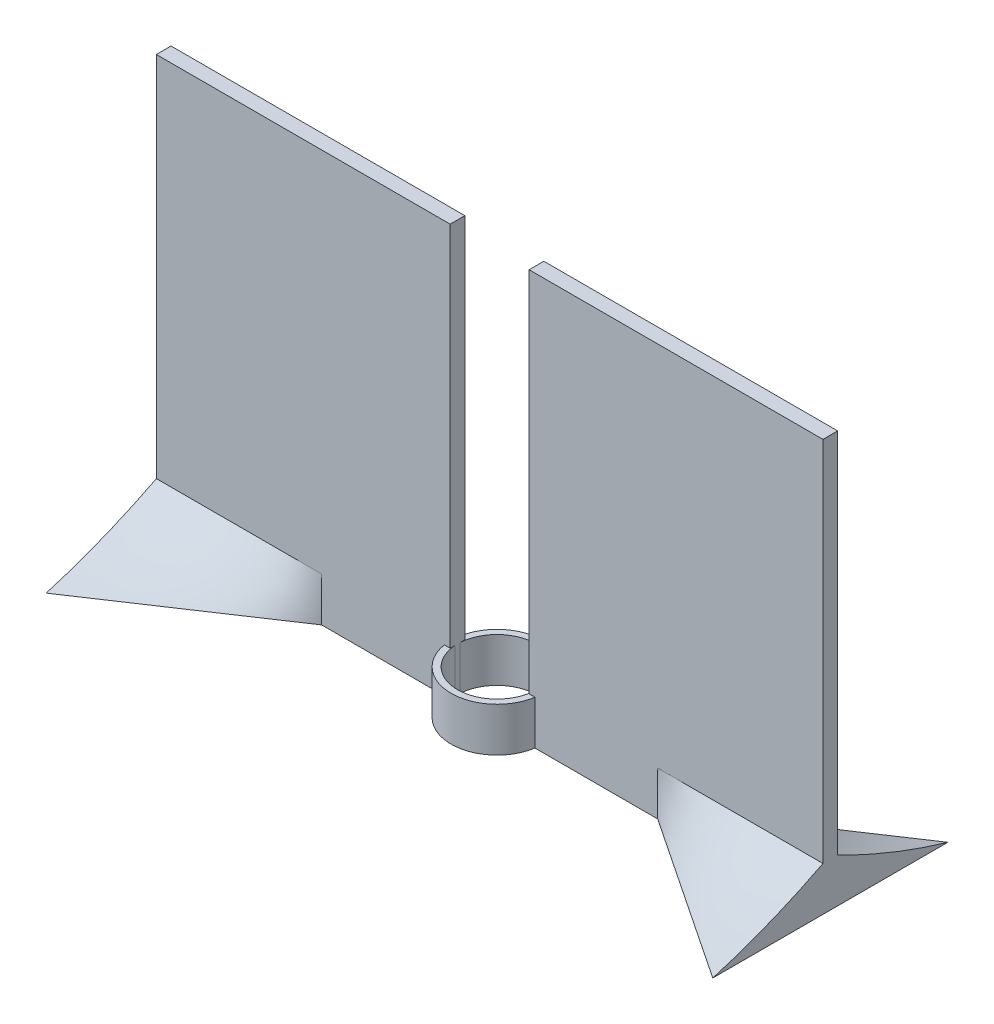
ISO-10303-21;
HEADER;
FILE_DESCRIPTION(('STEP AP214'),'2;1');
FILE_NAME('part.step','',(''),(''),'','','');
FILE_SCHEMA(('AUTOMOTIVE_DESIGN { 1 0 10303 214 1 1 1 1 }'));
ENDSEC;
DATA;
#1=APPLICATION_CONTEXT('core data for automotive mechanical design processes');
#2=APPLICATION_PROTOCOL_DEFINITION('international standard','automotive_design',2000,#1);
#3=PRODUCT_CONTEXT('',#1,'mechanical');
#4=PRODUCT('Part','Part','',(#3));
#5=PRODUCT_RELATED_PRODUCT_CATEGORY('part','',(#4));
#6=PRODUCT_DEFINITION_FORMATION('','',#4);
#7=PRODUCT_DEFINITION_CONTEXT('part definition',#1,'design');
#8=PRODUCT_DEFINITION('design','',#6,#7);
#9=PRODUCT_DEFINITION_SHAPE('','',#8);
#10=(LENGTH_UNIT() NAMED_UNIT(*) SI_UNIT(.MILLI.,.METRE.));
#11=(NAMED_UNIT(*) PLANE_ANGLE_UNIT() SI_UNIT($,.RADIAN.));
#12=(NAMED_UNIT(*) SI_UNIT($,.STERADIAN.) SOLID_ANGLE_UNIT());
#13=UNCERTAINTY_MEASURE_WITH_UNIT(LENGTH_MEASURE(1.E-05),#10,'distance_accuracy_value','');
#14=(GEOMETRIC_REPRESENTATION_CONTEXT(3) GLOBAL_UNCERTAINTY_ASSIGNED_CONTEXT((#13)) GLOBAL_UNIT_ASSIGNED_CONTEXT((#10,
#11,#12)) REPRESENTATION_CONTEXT('',''));
#15=CARTESIAN_POINT('',(0.,0.,0.));
#16=DIRECTION('',(0.,0.,1.));
#17=DIRECTION('',(1.,0.,0.));
#18=AXIS2_PLACEMENT_3D('',#15,#16,#17);
#19=CARTESIAN_POINT('',(0.,12.,0.));
#20=DIRECTION('',(0.,-1.,0.));
#21=DIRECTION('',(0.,0.,-1.));
#22=AXIS2_PLACEMENT_3D('',#19,#20,#21);
#23=CYLINDRICAL_SURFACE('',#22,10.775);
#24=CARTESIAN_POINT('',(0.,12.,0.));
#25=DIRECTION('',(0.,1.,0.));
#26=DIRECTION('',(0.,0.,1.));
#27=AXIS2_PLACEMENT_3D('',#24,#25,#26);
#28=CIRCLE('',#27,10.775);
#29=CARTESIAN_POINT('',(10.75,12.,-0.733570037556071));
#30=VERTEX_POINT('',#29);
#31=CARTESIAN_POINT('',(-10.75,12.,-0.733570037556071));
#32=VERTEX_POINT('',#31);
#33=EDGE_CURVE('E522',#30,#32,#28,.T.);
#34=ORIENTED_EDGE('',*,*,#33,.T.);
#35=DIRECTION('',(0.,-1.,0.));
#36=VECTOR('',#35,1.);
#37=CARTESIAN_POINT('',(-10.75,12.,-0.733570037556071));
#38=LINE('',#37,#36);
#39=CARTESIAN_POINT('',(-10.75,0.,-0.733570037556071));
#40=VERTEX_POINT('',#39);
#41=EDGE_CURVE('E81',#32,#40,#38,.T.);
#42=ORIENTED_EDGE('',*,*,#41,.T.);
#43=CARTESIAN_POINT('',(0.,0.,0.));
#44=DIRECTION('',(0.,1.,0.));
#45=DIRECTION('',(0.,0.,1.));
#46=AXIS2_PLACEMENT_3D('',#43,#44,#45);
#47=CIRCLE('',#46,10.775);
#48=CARTESIAN_POINT('',(10.75,0.,-0.733570037556071));
#49=VERTEX_POINT('',#48);
#50=EDGE_CURVE('E491',#49,#40,#47,.T.);
#51=ORIENTED_EDGE('',*,*,#50,.F.);
#52=DIRECTION('',(0.,-1.,0.));
#53=VECTOR('',#52,1.);
#54=CARTESIAN_POINT('',(10.75,12.,-0.733570037556071));
#55=LINE('',#54,#53);
#56=EDGE_CURVE('E488',#30,#49,#55,.T.);
#57=ORIENTED_EDGE('',*,*,#56,.F.);
#58=EDGE_LOOP('',(#34,#42,#51,#57));
#59=FACE_BOUND('',#58,.T.);
#60=ADVANCED_FACE('F53',(#59),#23,.F.);
#61=CARTESIAN_POINT('',(-10.75,0.,0.733570037556071));
#62=VERTEX_POINT('',#61);
#63=CARTESIAN_POINT('',(10.75,0.,0.733570037556071));
#64=VERTEX_POINT('',#63);
#65=EDGE_CURVE('E73',#62,#64,#47,.T.);
#66=ORIENTED_EDGE('',*,*,#65,.F.);
#67=DIRECTION('',(0.,-1.,0.));
#68=VECTOR('',#67,1.);
#69=CARTESIAN_POINT('',(-10.75,12.,0.733570037556071));
#70=LINE('',#69,#68);
#71=CARTESIAN_POINT('',(-10.75,12.,0.733570037556071));
#72=VERTEX_POINT('',#71);
#73=EDGE_CURVE('E526',#62,#72,#70,.F.);
#74=ORIENTED_EDGE('',*,*,#73,.T.);
#75=CARTESIAN_POINT('',(10.75,12.,0.733570037556071));
#76=VERTEX_POINT('',#75);
#77=EDGE_CURVE('E495',#72,#76,#28,.T.);
#78=ORIENTED_EDGE('',*,*,#77,.T.);
#79=DIRECTION('',(0.,-1.,0.));
#80=VECTOR('',#79,1.);
#81=CARTESIAN_POINT('',(10.75,12.,0.733570037556071));
#82=LINE('',#81,#80);
#83=EDGE_CURVE('E486',#64,#76,#82,.F.);
#84=ORIENTED_EDGE('',*,*,#83,.F.);
#85=EDGE_LOOP('',(#66,#74,#78,#84));
#86=FACE_BOUND('',#85,.T.);
#87=ADVANCED_FACE('F261',(#86),#23,.F.);
#88=CARTESIAN_POINT('',(0.,12.,0.));
#89=DIRECTION('',(0.,1.,0.));
#90=DIRECTION('',(0.,0.,1.));
#91=AXIS2_PLACEMENT_3D('',#88,#89,#90);
#92=PLANE('',#91);
#93=DIRECTION('',(0.,0.,1.));
#94=VECTOR('',#93,1.);
#95=CARTESIAN_POINT('',(-10.75,12.,0.));
#96=LINE('',#95,#94);
#97=CARTESIAN_POINT('',(-10.75,12.,2.));
#98=VERTEX_POINT('',#97);
#99=EDGE_CURVE('E65',#72,#98,#96,.T.);
#100=ORIENTED_EDGE('',*,*,#99,.T.);
#101=DIRECTION('',(-1.,0.,0.));
#102=VECTOR('',#101,1.);
#103=CARTESIAN_POINT('',(0.,12.,2.));
#104=LINE('',#103,#102);
#105=CARTESIAN_POINT('',(-12.3389626792531,12.,2.));
#106=VERTEX_POINT('',#105);
#107=EDGE_CURVE('E530',#98,#106,#104,.T.);
#108=ORIENTED_EDGE('',*,*,#107,.T.);
#109=CARTESIAN_POINT('',(0.,12.,0.));
#110=DIRECTION('',(0.,1.,0.));
#111=DIRECTION('',(0.,0.,1.));
#112=AXIS2_PLACEMENT_3D('',#109,#110,#111);
#113=CIRCLE('',#112,12.5);
#114=CARTESIAN_POINT('',(12.3389626792531,12.,2.));
#115=VERTEX_POINT('',#114);
#116=EDGE_CURVE('E517',#106,#115,#113,.T.);
#117=ORIENTED_EDGE('',*,*,#116,.T.);
#118=DIRECTION('',(1.,0.,0.));
#119=VECTOR('',#118,1.);
#120=CARTESIAN_POINT('',(90.75,12.,2.));
#121=LINE('',#120,#119);
#122=CARTESIAN_POINT('',(10.75,12.,2.));
#123=VERTEX_POINT('',#122);
#124=EDGE_CURVE('E507',#123,#115,#121,.T.);
#125=ORIENTED_EDGE('',*,*,#124,.F.);
#126=DIRECTION('',(0.,0.,1.));
#127=VECTOR('',#126,1.);
#128=CARTESIAN_POINT('',(10.75,12.,0.));
#129=LINE('',#128,#127);
#130=EDGE_CURVE('E382',#76,#123,#129,.T.);
#131=ORIENTED_EDGE('',*,*,#130,.F.);
#132=ORIENTED_EDGE('',*,*,#77,.F.);
#133=EDGE_LOOP('',(#100,#108,#117,#125,#131,#132));
#134=FACE_BOUND('',#133,.T.);
#135=ADVANCED_FACE('F268',(#134),#92,.T.);
#136=CARTESIAN_POINT('',(0.,12.,0.));
#137=DIRECTION('',(0.,-1.,0.));
#138=DIRECTION('',(0.,0.,-1.));
#139=AXIS2_PLACEMENT_3D('',#136,#137,#138);
#140=CYLINDRICAL_SURFACE('',#139,12.5);
#141=DIRECTION('',(0.,-1.,0.));
#142=VECTOR('',#141,1.);
#143=CARTESIAN_POINT('',(-12.3389626792531,12.,2.));
#144=LINE('',#143,#142);
#145=CARTESIAN_POINT('',(-12.3389626792531,0.,2.));
#146=VERTEX_POINT('',#145);
#147=EDGE_CURVE('E661',#146,#106,#144,.F.);
#148=ORIENTED_EDGE('',*,*,#147,.F.);
#149=CARTESIAN_POINT('',(0.,0.,0.));
#150=DIRECTION('',(0.,1.,0.));
#151=DIRECTION('',(0.,0.,1.));
#152=AXIS2_PLACEMENT_3D('',#149,#150,#151);
#153=CIRCLE('',#152,12.5);
#154=CARTESIAN_POINT('',(12.3389626792531,0.,2.));
#155=VERTEX_POINT('',#154);
#156=EDGE_CURVE('E225',#146,#155,#153,.T.);
#157=ORIENTED_EDGE('',*,*,#156,.T.);
#158=DIRECTION('',(0.,-1.,0.));
#159=VECTOR('',#158,1.);
#160=CARTESIAN_POINT('',(12.3389626792531,12.,2.));
#161=LINE('',#160,#159);
#162=EDGE_CURVE('E496',#155,#115,#161,.F.);
#163=ORIENTED_EDGE('',*,*,#162,.T.);
#164=ORIENTED_EDGE('',*,*,#116,.F.);
#165=EDGE_LOOP('',(#148,#157,#163,#164));
#166=FACE_BOUND('',#165,.T.);
#167=ADVANCED_FACE('F273',(#166),#140,.T.);
#168=CARTESIAN_POINT('',(90.75,112.,-2.));
#169=DIRECTION('',(0.,0.,-1.));
#170=DIRECTION('',(-1.,0.,0.));
#171=AXIS2_PLACEMENT_3D('',#168,#169,#170);
#172=PLANE('',#171);
#173=DIRECTION('',(1.,0.,0.));
#174=VECTOR('',#173,1.);
#175=CARTESIAN_POINT('',(90.75,12.,-2.));
#176=LINE('',#175,#174);
#177=CARTESIAN_POINT('',(10.75,12.,-2.));
#178=VERTEX_POINT('',#177);
#179=CARTESIAN_POINT('',(12.3389626792531,12.,-2.));
#180=VERTEX_POINT('',#179);
#181=EDGE_CURVE('E473',#178,#180,#176,.T.);
#182=ORIENTED_EDGE('',*,*,#181,.F.);
#183=DIRECTION('',(0.,-1.,0.));
#184=VECTOR('',#183,1.);
#185=CARTESIAN_POINT('',(10.75,112.,-2.));
#186=LINE('',#185,#184);
#187=CARTESIAN_POINT('',(10.75,112.,-2.));
#188=VERTEX_POINT('',#187);
#189=EDGE_CURVE('E370',#188,#178,#186,.T.);
#190=ORIENTED_EDGE('',*,*,#189,.F.);
#191=DIRECTION('',(-1.,0.,0.));
#192=VECTOR('',#191,1.);
#193=CARTESIAN_POINT('',(90.75,112.,-2.));
#194=LINE('',#193,#192);
#195=CARTESIAN_POINT('',(90.75,112.,-2.));
#196=VERTEX_POINT('',#195);
#197=EDGE_CURVE('E365',#196,#188,#194,.T.);
#198=ORIENTED_EDGE('',*,*,#197,.F.);
#199=DIRECTION('',(0.,-1.,0.));
#200=VECTOR('',#199,1.);
#201=CARTESIAN_POINT('',(90.75,112.,-2.));
#202=LINE('',#201,#200);
#203=CARTESIAN_POINT('',(90.75,12.,-2.));
#204=VERTEX_POINT('',#203);
#205=EDGE_CURVE('E408',#196,#204,#202,.T.);
#206=ORIENTED_EDGE('',*,*,#205,.T.);
#207=DIRECTION('',(-1.,0.,0.));
#208=VECTOR('',#207,1.);
#209=CARTESIAN_POINT('',(90.75,12.,-2.));
#210=LINE('',#209,#208);
#211=CARTESIAN_POINT('',(45.75,12.,-2.));
#212=VERTEX_POINT('',#211);
#213=EDGE_CURVE('E391',#204,#212,#210,.T.);
#214=ORIENTED_EDGE('',*,*,#213,.T.);
#215=CARTESIAN_POINT('',(45.75,0.,-2.));
#216=CARTESIAN_POINT('',(45.75,2.00000000000001,-2.));
#217=CARTESIAN_POINT('',(45.75,4.00000000000001,-2.));
#218=CARTESIAN_POINT('',(45.75,8.00000000000001,-2.));
#219=CARTESIAN_POINT('',(45.75,10.,-2.));
#220=CARTESIAN_POINT('',(45.75,12.,-2.));
#221=B_SPLINE_CURVE_WITH_KNOTS('',3,(#215,#216,#217,#218,#219,#220),.UNSPECIFIED.,.F.,.F.,(4,2,
4),(0.,0.5,1.),.UNSPECIFIED.);
#222=CARTESIAN_POINT('',(45.75,0.,-2.));
#223=VERTEX_POINT('',#222);
#224=EDGE_CURVE('E331',#212,#223,#221,.F.);
#225=ORIENTED_EDGE('',*,*,#224,.T.);
#226=DIRECTION('',(-1.,0.,0.));
#227=VECTOR('',#226,1.);
#228=CARTESIAN_POINT('',(45.75,0.,-2.));
#229=LINE('',#228,#227);
#230=CARTESIAN_POINT('',(12.3389626792531,0.,-2.));
#231=VERTEX_POINT('',#230);
#232=EDGE_CURVE('E337',#223,#231,#229,.T.);
#233=ORIENTED_EDGE('',*,*,#232,.T.);
#234=DIRECTION('',(0.,-1.,0.));
#235=VECTOR('',#234,1.);
#236=CARTESIAN_POINT('',(12.3389626792531,12.,-2.));
#237=LINE('',#236,#235);
#238=EDGE_CURVE('E499',#231,#180,#237,.F.);
#239=ORIENTED_EDGE('',*,*,#238,.T.);
#240=EDGE_LOOP('',(#182,#190,#198,#206,#214,#225,#233,#239));
#241=FACE_BOUND('',#240,.T.);
#242=ADVANCED_FACE('F339',(#241),#172,.T.);
#243=CARTESIAN_POINT('',(90.75,112.,-2.));
#244=DIRECTION('',(0.,-1.,0.));
#245=DIRECTION('',(0.,0.,-1.));
#246=AXIS2_PLACEMENT_3D('',#243,#244,#245);
#247=PLANE('',#246);
#248=DIRECTION('',(0.,0.,1.));
#249=VECTOR('',#248,1.);
#250=CARTESIAN_POINT('',(10.75,112.,-2.));
#251=LINE('',#250,#249);
#252=CARTESIAN_POINT('',(10.75,112.,2.));
#253=VERTEX_POINT('',#252);
#254=EDGE_CURVE('E360',#188,#253,#251,.T.);
#255=ORIENTED_EDGE('',*,*,#254,.T.);
#256=DIRECTION('',(-1.,0.,0.));
#257=VECTOR('',#256,1.);
#258=CARTESIAN_POINT('',(90.75,112.,2.));
#259=LINE('',#258,#257);
#260=CARTESIAN_POINT('',(90.75,112.,2.));
#261=VERTEX_POINT('',#260);
#262=EDGE_CURVE('E363',#261,#253,#259,.T.);
#263=ORIENTED_EDGE('',*,*,#262,.F.);
#264=DIRECTION('',(0.,0.,1.));
#265=VECTOR('',#264,1.);
#266=CARTESIAN_POINT('',(90.75,112.,-2.));
#267=LINE('',#266,#265);
#268=EDGE_CURVE('E387',#196,#261,#267,.T.);
#269=ORIENTED_EDGE('',*,*,#268,.F.);
#270=ORIENTED_EDGE('',*,*,#197,.T.);
#271=EDGE_LOOP('',(#255,#263,#269,#270));
#272=FACE_BOUND('',#271,.T.);
#273=ADVANCED_FACE('F348',(#272),#247,.F.);
#274=CARTESIAN_POINT('',(90.75,112.,2.));
#275=DIRECTION('',(0.,0.,-1.));
#276=DIRECTION('',(-1.,0.,0.));
#277=AXIS2_PLACEMENT_3D('',#274,#275,#276);
#278=PLANE('',#277);
#279=DIRECTION('',(0.,-1.,0.));
#280=VECTOR('',#279,1.);
#281=CARTESIAN_POINT('',(10.75,112.,2.));
#282=LINE('',#281,#280);
#283=EDGE_CURVE('E371',#253,#123,#282,.T.);
#284=ORIENTED_EDGE('',*,*,#283,.T.);
#285=ORIENTED_EDGE('',*,*,#124,.T.);
#286=ORIENTED_EDGE('',*,*,#162,.F.);
#287=DIRECTION('',(-1.,0.,0.));
#288=VECTOR('',#287,1.);
#289=CARTESIAN_POINT('',(45.75,0.,2.));
#290=LINE('',#289,#288);
#291=CARTESIAN_POINT('',(45.75,0.,2.));
#292=VERTEX_POINT('',#291);
#293=EDGE_CURVE('E383',#292,#155,#290,.T.);
#294=ORIENTED_EDGE('',*,*,#293,.F.);
#295=CARTESIAN_POINT('',(45.75,12.,2.));
#296=CARTESIAN_POINT('',(45.75,10.,2.));
#297=CARTESIAN_POINT('',(45.75,8.,2.));
#298=CARTESIAN_POINT('',(45.75,4.,2.));
#299=CARTESIAN_POINT('',(45.75,2.,2.));
#300=CARTESIAN_POINT('',(45.75,0.,2.));
#301=B_SPLINE_CURVE_WITH_KNOTS('',3,(#295,#296,#297,#298,#299,#300),.UNSPECIFIED.,.F.,.F.,(4,2,
4),(0.,0.5,1.),.UNSPECIFIED.);
#302=CARTESIAN_POINT('',(45.75,12.,2.));
#303=VERTEX_POINT('',#302);
#304=EDGE_CURVE('E397',#303,#292,#301,.T.);
#305=ORIENTED_EDGE('',*,*,#304,.F.);
#306=DIRECTION('',(-1.,0.,0.));
#307=VECTOR('',#306,1.);
#308=CARTESIAN_POINT('',(90.75,12.,2.));
#309=LINE('',#308,#307);
#310=CARTESIAN_POINT('',(90.75,12.,2.));
#311=VERTEX_POINT('',#310);
#312=EDGE_CURVE('E377',#311,#303,#309,.T.);
#313=ORIENTED_EDGE('',*,*,#312,.F.);
#314=DIRECTION('',(0.,-1.,0.));
#315=VECTOR('',#314,1.);
#316=CARTESIAN_POINT('',(90.75,112.,2.));
#317=LINE('',#316,#315);
#318=EDGE_CURVE('E376',#261,#311,#317,.T.);
#319=ORIENTED_EDGE('',*,*,#318,.F.);
#320=ORIENTED_EDGE('',*,*,#262,.T.);
#321=EDGE_LOOP('',(#284,#285,#286,#294,#305,#313,#319,#320));
#322=FACE_BOUND('',#321,.T.);
#323=ADVANCED_FACE('F55',(#322),#278,.F.);
#324=CARTESIAN_POINT('',(90.75,0.,0.));
#325=DIRECTION('',(1.,0.,0.));
#326=DIRECTION('',(0.,0.,-1.));
#327=AXIS2_PLACEMENT_3D('',#324,#325,#326);
#328=PLANE('',#327);
#329=ORIENTED_EDGE('',*,*,#318,.T.);
#330=CARTESIAN_POINT('',(90.75,12.,2.));
#331=CARTESIAN_POINT('',(90.75,4.56135462593959,16.4383660270901));
#332=CARTESIAN_POINT('',(90.75,0.,32.));
#333=B_SPLINE_CURVE_WITH_KNOTS('',2,(#330,#331,#332),.UNSPECIFIED.,.F.,.F.,(3,3),(0.,1.),.UNSPECIFIED.);
#334=CARTESIAN_POINT('',(90.75,0.,32.));
#335=VERTEX_POINT('',#334);
#336=EDGE_CURVE('E414',#311,#335,#333,.T.);
#337=ORIENTED_EDGE('',*,*,#336,.T.);
#338=DIRECTION('',(0.,0.,-1.));
#339=VECTOR('',#338,1.);
#340=CARTESIAN_POINT('',(90.75,0.,32.));
#341=LINE('',#340,#339);
#342=CARTESIAN_POINT('',(90.75,0.,-32.));
#343=VERTEX_POINT('',#342);
#344=EDGE_CURVE('E323',#335,#343,#341,.T.);
#345=ORIENTED_EDGE('',*,*,#344,.T.);
#346=CARTESIAN_POINT('',(90.75,0.,-32.));
#347=CARTESIAN_POINT('',(90.75,4.56135462593959,-16.4383660270901));
#348=CARTESIAN_POINT('',(90.75,12.,-2.));
#349=B_SPLINE_CURVE_WITH_KNOTS('',2,(#346,#347,#348),.UNSPECIFIED.,.F.,.F.,(3,3),(0.,1.),.UNSPECIFIED.);
#350=EDGE_CURVE('E318',#343,#204,#349,.T.);
#351=ORIENTED_EDGE('',*,*,#350,.T.);
#352=ORIENTED_EDGE('',*,*,#205,.F.);
#353=ORIENTED_EDGE('',*,*,#268,.T.);
#354=EDGE_LOOP('',(#329,#337,#345,#351,#352,#353));
#355=FACE_BOUND('',#354,.T.);
#356=ADVANCED_FACE('F356',(#355),#328,.T.);
#357=CARTESIAN_POINT('',(10.75,0.,0.));
#358=DIRECTION('',(1.,0.,0.));
#359=DIRECTION('',(0.,0.,-1.));
#360=AXIS2_PLACEMENT_3D('',#357,#358,#359);
#361=PLANE('',#360);
#362=ORIENTED_EDGE('',*,*,#83,.T.);
#363=ORIENTED_EDGE('',*,*,#130,.T.);
#364=ORIENTED_EDGE('',*,*,#283,.F.);
#365=ORIENTED_EDGE('',*,*,#254,.F.);
#366=ORIENTED_EDGE('',*,*,#189,.T.);
#367=EDGE_CURVE('E419',#178,#30,#129,.T.);
#368=ORIENTED_EDGE('',*,*,#367,.T.);
#369=ORIENTED_EDGE('',*,*,#56,.T.);
#370=DIRECTION('',(0.,0.,1.));
#371=VECTOR('',#370,1.);
#372=CARTESIAN_POINT('',(10.75,0.,-2.));
#373=LINE('',#372,#371);
#374=EDGE_CURVE('E322',#49,#64,#373,.T.);
#375=ORIENTED_EDGE('',*,*,#374,.T.);
#376=EDGE_LOOP('',(#362,#363,#364,#365,#366,#368,#369,#375));
#377=FACE_BOUND('',#376,.T.);
#378=ADVANCED_FACE('F349',(#377),#361,.F.);
#379=CARTESIAN_POINT('',(45.75,0.,-2.));
#380=DIRECTION('',(0.,-1.,0.));
#381=DIRECTION('',(0.,0.,-1.));
#382=AXIS2_PLACEMENT_3D('',#379,#380,#381);
#383=PLANE('',#382);
#384=DIRECTION('',(0.,0.,1.));
#385=VECTOR('',#384,1.);
#386=CARTESIAN_POINT('',(-10.75,0.,-2.));
#387=LINE('',#386,#385);
#388=EDGE_CURVE('E238',#40,#62,#387,.T.);
#389=ORIENTED_EDGE('',*,*,#388,.T.);
#390=ORIENTED_EDGE('',*,*,#65,.T.);
#391=ORIENTED_EDGE('',*,*,#374,.F.);
#392=ORIENTED_EDGE('',*,*,#50,.T.);
#393=EDGE_LOOP('',(#389,#390,#391,#392));
#394=FACE_BOUND('',#393,.T.);
#395=ORIENTED_EDGE('',*,*,#156,.F.);
#396=DIRECTION('',(1.,0.,0.));
#397=VECTOR('',#396,1.);
#398=CARTESIAN_POINT('',(-45.75,0.,2.));
#399=LINE('',#398,#397);
#400=CARTESIAN_POINT('',(-45.75,0.,2.));
#401=VERTEX_POINT('',#400);
#402=EDGE_CURVE('E222',#401,#146,#399,.T.);
#403=ORIENTED_EDGE('',*,*,#402,.F.);
#404=DIRECTION('',(-0.832050294337844,0.,0.554700196225229));
#405=VECTOR('',#404,1.);
#406=CARTESIAN_POINT('',(-68.25,0.,17.));
#407=LINE('',#406,#405);
#408=CARTESIAN_POINT('',(-90.75,0.,32.));
#409=VERTEX_POINT('',#408);
#410=EDGE_CURVE('E206',#401,#409,#407,.T.);
#411=ORIENTED_EDGE('',*,*,#410,.T.);
#412=DIRECTION('',(0.,0.,-1.));
#413=VECTOR('',#412,1.);
#414=CARTESIAN_POINT('',(-90.75,0.,32.));
#415=LINE('',#414,#413);
#416=CARTESIAN_POINT('',(-90.75,0.,-32.));
#417=VERTEX_POINT('',#416);
#418=EDGE_CURVE('E567',#409,#417,#415,.T.);
#419=ORIENTED_EDGE('',*,*,#418,.T.);
#420=DIRECTION('',(0.832050294337844,0.,0.554700196225229));
#421=VECTOR('',#420,1.);
#422=CARTESIAN_POINT('',(-68.25,0.,-17.));
#423=LINE('',#422,#421);
#424=CARTESIAN_POINT('',(-45.75,0.,-2.));
#425=VERTEX_POINT('',#424);
#426=EDGE_CURVE('E219',#417,#425,#423,.T.);
#427=ORIENTED_EDGE('',*,*,#426,.T.);
#428=DIRECTION('',(1.,0.,0.));
#429=VECTOR('',#428,1.);
#430=CARTESIAN_POINT('',(-45.75,0.,-2.));
#431=LINE('',#430,#429);
#432=CARTESIAN_POINT('',(-12.3389626792531,0.,-2.));
#433=VERTEX_POINT('',#432);
#434=EDGE_CURVE('E230',#425,#433,#431,.T.);
#435=ORIENTED_EDGE('',*,*,#434,.T.);
#436=EDGE_CURVE('E520',#231,#433,#153,.T.);
#437=ORIENTED_EDGE('',*,*,#436,.F.);
#438=ORIENTED_EDGE('',*,*,#232,.F.);
#439=DIRECTION('',(-0.832050294337844,0.,0.554700196225229));
#440=VECTOR('',#439,1.);
#441=CARTESIAN_POINT('',(68.25,0.,-17.));
#442=LINE('',#441,#440);
#443=EDGE_CURVE('E468',#343,#223,#442,.T.);
#444=ORIENTED_EDGE('',*,*,#443,.F.);
#445=ORIENTED_EDGE('',*,*,#344,.F.);
#446=DIRECTION('',(0.832050294337844,0.,0.554700196225229));
#447=VECTOR('',#446,1.);
#448=CARTESIAN_POINT('',(68.25,0.,17.));
#449=LINE('',#448,#447);
#450=EDGE_CURVE('E417',#292,#335,#449,.T.);
#451=ORIENTED_EDGE('',*,*,#450,.F.);
#452=ORIENTED_EDGE('',*,*,#293,.T.);
#453=EDGE_LOOP('',(#395,#403,#411,#419,#427,#435,#437,#438,#444,#445,#451,#452));
#454=FACE_BOUND('',#453,.T.);
#455=ADVANCED_FACE('F223',(#394,#454),#383,.T.);
#456=CARTESIAN_POINT('',(45.75,0.,-2.));
#457=CARTESIAN_POINT('',(90.75,0.,-32.));
#458=CARTESIAN_POINT('',(45.75,2.00000000000001,-2.));
#459=CARTESIAN_POINT('',(90.75,1.52045154197986,-26.8127886756967));
#460=CARTESIAN_POINT('',(45.75,4.00000000000001,-2.));
#461=CARTESIAN_POINT('',(90.75,3.28067731296979,-21.7191830135451));
#462=CARTESIAN_POINT('',(45.75,8.00000000000001,-2.));
#463=CARTESIAN_POINT('',(90.75,7.28067731296979,-11.7191830135451));
#464=CARTESIAN_POINT('',(45.75,10.,-2.));
#465=CARTESIAN_POINT('',(90.75,9.52045154197986,-6.81278867569671));
#466=CARTESIAN_POINT('',(45.75,12.,-2.));
#467=CARTESIAN_POINT('',(90.75,12.,-2.));
#468=B_SPLINE_SURFACE_WITH_KNOTS('',3,1,((#456,#457),(#458,#459),(#460,#461),(#462,#463),(#464,
#465),(#466,#467)),.UNSPECIFIED.,.F.,.F.,.F.,(4,2,4),(2,2),(0.,0.5,1.),(0.,1.),.UNSPECIFIED.);
#469=ORIENTED_EDGE('',*,*,#224,.F.);
#470=ORIENTED_EDGE('',*,*,#213,.F.);
#471=ORIENTED_EDGE('',*,*,#350,.F.);
#472=ORIENTED_EDGE('',*,*,#443,.T.);
#473=EDGE_LOOP('',(#469,#470,#471,#472));
#474=FACE_BOUND('',#473,.T.);
#475=ADVANCED_FACE('F274',(#474),#468,.T.);
#476=CARTESIAN_POINT('',(45.75,12.,2.));
#477=CARTESIAN_POINT('',(90.75,12.,2.));
#478=CARTESIAN_POINT('',(45.75,10.,2.));
#479=CARTESIAN_POINT('',(90.75,9.52045154197986,6.81278867569671));
#480=CARTESIAN_POINT('',(45.75,8.,2.));
#481=CARTESIAN_POINT('',(90.75,7.28067731296979,11.7191830135451));
#482=CARTESIAN_POINT('',(45.75,4.,2.));
#483=CARTESIAN_POINT('',(90.75,3.28067731296979,21.7191830135451));
#484=CARTESIAN_POINT('',(45.75,2.,2.));
#485=CARTESIAN_POINT('',(90.75,1.52045154197986,26.8127886756967));
#486=CARTESIAN_POINT('',(45.75,0.,2.));
#487=CARTESIAN_POINT('',(90.75,0.,32.));
#488=B_SPLINE_SURFACE_WITH_KNOTS('',3,1,((#476,#477),(#478,#479),(#480,#481),(#482,#483),(#484,
#485),(#486,#487)),.UNSPECIFIED.,.F.,.F.,.F.,(4,2,4),(2,2),(0.,0.5,1.),(0.,1.),.UNSPECIFIED.);
#489=ORIENTED_EDGE('',*,*,#304,.T.);
#490=ORIENTED_EDGE('',*,*,#450,.T.);
#491=ORIENTED_EDGE('',*,*,#336,.F.);
#492=ORIENTED_EDGE('',*,*,#312,.T.);
#493=EDGE_LOOP('',(#489,#490,#491,#492));
#494=FACE_BOUND('',#493,.T.);
#495=ADVANCED_FACE('F266',(#494),#488,.T.);
#496=DIRECTION('',(-1.,0.,0.));
#497=VECTOR('',#496,1.);
#498=CARTESIAN_POINT('',(0.,12.,-2.));
#499=LINE('',#498,#497);
#500=CARTESIAN_POINT('',(-10.75,12.,-2.));
#501=VERTEX_POINT('',#500);
#502=CARTESIAN_POINT('',(-12.3389626792531,12.,-2.));
#503=VERTEX_POINT('',#502);
#504=EDGE_CURVE('E528',#501,#503,#499,.T.);
#505=ORIENTED_EDGE('',*,*,#504,.F.);
#506=EDGE_CURVE('E12',#501,#32,#96,.T.);
#507=ORIENTED_EDGE('',*,*,#506,.T.);
#508=ORIENTED_EDGE('',*,*,#33,.F.);
#509=ORIENTED_EDGE('',*,*,#367,.F.);
#510=ORIENTED_EDGE('',*,*,#181,.T.);
#511=EDGE_CURVE('E501',#180,#503,#113,.T.);
#512=ORIENTED_EDGE('',*,*,#511,.T.);
#513=EDGE_LOOP('',(#505,#507,#508,#509,#510,#512));
#514=FACE_BOUND('',#513,.T.);
#515=ADVANCED_FACE('F262',(#514),#92,.T.);
#516=ORIENTED_EDGE('',*,*,#436,.T.);
#517=DIRECTION('',(0.,-1.,0.));
#518=VECTOR('',#517,1.);
#519=CARTESIAN_POINT('',(-12.3389626792531,12.,-2.));
#520=LINE('',#519,#518);
#521=EDGE_CURVE('E516',#433,#503,#520,.F.);
#522=ORIENTED_EDGE('',*,*,#521,.T.);
#523=ORIENTED_EDGE('',*,*,#511,.F.);
#524=ORIENTED_EDGE('',*,*,#238,.F.);
#525=EDGE_LOOP('',(#516,#522,#523,#524));
#526=FACE_BOUND('',#525,.T.);
#527=ADVANCED_FACE('F265',(#526),#140,.T.);
#528=CARTESIAN_POINT('',(-90.75,112.,-2.));
#529=DIRECTION('',(0.,0.,-1.));
#530=DIRECTION('',(1.,0.,0.));
#531=AXIS2_PLACEMENT_3D('',#528,#529,#530);
#532=PLANE('',#531);
#533=DIRECTION('',(0.,-1.,0.));
#534=VECTOR('',#533,1.);
#535=CARTESIAN_POINT('',(-10.75,112.,-2.));
#536=LINE('',#535,#534);
#537=CARTESIAN_POINT('',(-10.75,112.,-2.));
#538=VERTEX_POINT('',#537);
#539=EDGE_CURVE('E595',#538,#501,#536,.T.);
#540=ORIENTED_EDGE('',*,*,#539,.T.);
#541=ORIENTED_EDGE('',*,*,#504,.T.);
#542=ORIENTED_EDGE('',*,*,#521,.F.);
#543=ORIENTED_EDGE('',*,*,#434,.F.);
#544=CARTESIAN_POINT('',(-45.75,12.,-2.));
#545=CARTESIAN_POINT('',(-45.75,10.,-2.));
#546=CARTESIAN_POINT('',(-45.75,8.00000000000001,-2.));
#547=CARTESIAN_POINT('',(-45.75,4.00000000000001,-2.));
#548=CARTESIAN_POINT('',(-45.75,2.00000000000001,-2.));
#549=CARTESIAN_POINT('',(-45.75,0.,-2.));
#550=B_SPLINE_CURVE_WITH_KNOTS('',3,(#544,#545,#546,#547,#548,#549),.UNSPECIFIED.,.F.,.F.,(4,2,
4),(0.,0.5,1.),.UNSPECIFIED.);
#551=CARTESIAN_POINT('',(-45.75,12.,-2.));
#552=VERTEX_POINT('',#551);
#553=EDGE_CURVE('E237',#552,#425,#550,.T.);
#554=ORIENTED_EDGE('',*,*,#553,.F.);
#555=DIRECTION('',(1.,0.,0.));
#556=VECTOR('',#555,1.);
#557=CARTESIAN_POINT('',(-90.75,12.,-2.));
#558=LINE('',#557,#556);
#559=CARTESIAN_POINT('',(-90.75,12.,-2.));
#560=VERTEX_POINT('',#559);
#561=EDGE_CURVE('E532',#560,#552,#558,.T.);
#562=ORIENTED_EDGE('',*,*,#561,.F.);
#563=DIRECTION('',(0.,-1.,0.));
#564=VECTOR('',#563,1.);
#565=CARTESIAN_POINT('',(-90.75,112.,-2.));
#566=LINE('',#565,#564);
#567=CARTESIAN_POINT('',(-90.75,112.,-2.));
#568=VERTEX_POINT('',#567);
#569=EDGE_CURVE('E588',#568,#560,#566,.T.);
#570=ORIENTED_EDGE('',*,*,#569,.F.);
#571=DIRECTION('',(1.,0.,0.));
#572=VECTOR('',#571,1.);
#573=CARTESIAN_POINT('',(-90.75,112.,-2.));
#574=LINE('',#573,#572);
#575=EDGE_CURVE('E598',#568,#538,#574,.T.);
#576=ORIENTED_EDGE('',*,*,#575,.T.);
#577=EDGE_LOOP('',(#540,#541,#542,#543,#554,#562,#570,#576));
#578=FACE_BOUND('',#577,.T.);
#579=ADVANCED_FACE('F271',(#578),#532,.T.);
#580=CARTESIAN_POINT('',(-90.75,112.,-2.));
#581=DIRECTION('',(0.,-1.,0.));
#582=DIRECTION('',(0.,0.,-1.));
#583=AXIS2_PLACEMENT_3D('',#580,#581,#582);
#584=PLANE('',#583);
#585=DIRECTION('',(0.,0.,1.));
#586=VECTOR('',#585,1.);
#587=CARTESIAN_POINT('',(-10.75,112.,-2.));
#588=LINE('',#587,#586);
#589=CARTESIAN_POINT('',(-10.75,112.,2.));
#590=VERTEX_POINT('',#589);
#591=EDGE_CURVE('E592',#538,#590,#588,.T.);
#592=ORIENTED_EDGE('',*,*,#591,.F.);
#593=ORIENTED_EDGE('',*,*,#575,.F.);
#594=DIRECTION('',(0.,0.,1.));
#595=VECTOR('',#594,1.);
#596=CARTESIAN_POINT('',(-90.75,112.,-2.));
#597=LINE('',#596,#595);
#598=CARTESIAN_POINT('',(-90.75,112.,2.));
#599=VERTEX_POINT('',#598);
#600=EDGE_CURVE('E585',#568,#599,#597,.T.);
#601=ORIENTED_EDGE('',*,*,#600,.T.);
#602=DIRECTION('',(1.,0.,0.));
#603=VECTOR('',#602,1.);
#604=CARTESIAN_POINT('',(-90.75,112.,2.));
#605=LINE('',#604,#603);
#606=EDGE_CURVE('E601',#599,#590,#605,.T.);
#607=ORIENTED_EDGE('',*,*,#606,.T.);
#608=EDGE_LOOP('',(#592,#593,#601,#607));
#609=FACE_BOUND('',#608,.T.);
#610=ADVANCED_FACE('F257',(#609),#584,.F.);
#611=CARTESIAN_POINT('',(-90.75,112.,2.));
#612=DIRECTION('',(0.,0.,-1.));
#613=DIRECTION('',(1.,0.,0.));
#614=AXIS2_PLACEMENT_3D('',#611,#612,#613);
#615=PLANE('',#614);
#616=ORIENTED_EDGE('',*,*,#107,.F.);
#617=DIRECTION('',(0.,-1.,0.));
#618=VECTOR('',#617,1.);
#619=CARTESIAN_POINT('',(-10.75,112.,2.));
#620=LINE('',#619,#618);
#621=EDGE_CURVE('E229',#590,#98,#620,.T.);
#622=ORIENTED_EDGE('',*,*,#621,.F.);
#623=ORIENTED_EDGE('',*,*,#606,.F.);
#624=DIRECTION('',(0.,-1.,0.));
#625=VECTOR('',#624,1.);
#626=CARTESIAN_POINT('',(-90.75,112.,2.));
#627=LINE('',#626,#625);
#628=CARTESIAN_POINT('',(-90.75,12.,2.));
#629=VERTEX_POINT('',#628);
#630=EDGE_CURVE('E589',#599,#629,#627,.T.);
#631=ORIENTED_EDGE('',*,*,#630,.T.);
#632=DIRECTION('',(1.,0.,0.));
#633=VECTOR('',#632,1.);
#634=CARTESIAN_POINT('',(-90.75,12.,2.));
#635=LINE('',#634,#633);
#636=CARTESIAN_POINT('',(-45.75,12.,2.));
#637=VERTEX_POINT('',#636);
#638=EDGE_CURVE('E236',#629,#637,#635,.T.);
#639=ORIENTED_EDGE('',*,*,#638,.T.);
#640=CARTESIAN_POINT('',(-45.75,0.,2.));
#641=CARTESIAN_POINT('',(-45.75,2.,2.));
#642=CARTESIAN_POINT('',(-45.75,4.,2.));
#643=CARTESIAN_POINT('',(-45.75,8.,2.));
#644=CARTESIAN_POINT('',(-45.75,10.,2.));
#645=CARTESIAN_POINT('',(-45.75,12.,2.));
#646=B_SPLINE_CURVE_WITH_KNOTS('',3,(#640,#641,#642,#643,#644,#645),.UNSPECIFIED.,.F.,.F.,(4,2,
4),(0.,0.5,1.),.UNSPECIFIED.);
#647=EDGE_CURVE('E211',#637,#401,#646,.F.);
#648=ORIENTED_EDGE('',*,*,#647,.T.);
#649=ORIENTED_EDGE('',*,*,#402,.T.);
#650=ORIENTED_EDGE('',*,*,#147,.T.);
#651=EDGE_LOOP('',(#616,#622,#623,#631,#639,#648,#649,#650));
#652=FACE_BOUND('',#651,.T.);
#653=ADVANCED_FACE('F234',(#652),#615,.F.);
#654=CARTESIAN_POINT('',(-90.75,0.,0.));
#655=DIRECTION('',(-1.,0.,0.));
#656=DIRECTION('',(0.,0.,-1.));
#657=AXIS2_PLACEMENT_3D('',#654,#655,#656);
#658=PLANE('',#657);
#659=ORIENTED_EDGE('',*,*,#630,.F.);
#660=ORIENTED_EDGE('',*,*,#600,.F.);
#661=ORIENTED_EDGE('',*,*,#569,.T.);
#662=CARTESIAN_POINT('',(-90.75,0.,-32.));
#663=CARTESIAN_POINT('',(-90.75,4.56135462593959,-16.4383660270901));
#664=CARTESIAN_POINT('',(-90.75,12.,-2.));
#665=B_SPLINE_CURVE_WITH_KNOTS('',2,(#662,#663,#664),.UNSPECIFIED.,.F.,.F.,(3,3),(0.,1.),.UNSPECIFIED.);
#666=EDGE_CURVE('E576',#417,#560,#665,.T.);
#667=ORIENTED_EDGE('',*,*,#666,.F.);
#668=ORIENTED_EDGE('',*,*,#418,.F.);
#669=CARTESIAN_POINT('',(-90.75,12.,2.));
#670=CARTESIAN_POINT('',(-90.75,4.56135462593959,16.4383660270901));
#671=CARTESIAN_POINT('',(-90.75,0.,32.));
#672=B_SPLINE_CURVE_WITH_KNOTS('',2,(#669,#670,#671),.UNSPECIFIED.,.F.,.F.,(3,3),(0.,1.),.UNSPECIFIED.);
#673=EDGE_CURVE('E214',#629,#409,#672,.T.);
#674=ORIENTED_EDGE('',*,*,#673,.F.);
#675=EDGE_LOOP('',(#659,#660,#661,#667,#668,#674));
#676=FACE_BOUND('',#675,.T.);
#677=ADVANCED_FACE('F256',(#676),#658,.T.);
#678=CARTESIAN_POINT('',(-10.75,0.,0.));
#679=DIRECTION('',(-1.,0.,0.));
#680=DIRECTION('',(0.,0.,-1.));
#681=AXIS2_PLACEMENT_3D('',#678,#679,#680);
#682=PLANE('',#681);
#683=ORIENTED_EDGE('',*,*,#41,.F.);
#684=ORIENTED_EDGE('',*,*,#506,.F.);
#685=ORIENTED_EDGE('',*,*,#539,.F.);
#686=ORIENTED_EDGE('',*,*,#591,.T.);
#687=ORIENTED_EDGE('',*,*,#621,.T.);
#688=ORIENTED_EDGE('',*,*,#99,.F.);
#689=ORIENTED_EDGE('',*,*,#73,.F.);
#690=ORIENTED_EDGE('',*,*,#388,.F.);
#691=EDGE_LOOP('',(#683,#684,#685,#686,#687,#688,#689,#690));
#692=FACE_BOUND('',#691,.T.);
#693=ADVANCED_FACE('F548',(#692),#682,.F.);
#694=CARTESIAN_POINT('',(-45.75,0.,-2.));
#695=CARTESIAN_POINT('',(-90.75,0.,-32.));
#696=CARTESIAN_POINT('',(-45.75,2.00000000000001,-2.));
#697=CARTESIAN_POINT('',(-90.75,1.52045154197986,-26.8127886756967));
#698=CARTESIAN_POINT('',(-45.75,4.00000000000001,-2.));
#699=CARTESIAN_POINT('',(-90.75,3.28067731296979,-21.7191830135451));
#700=CARTESIAN_POINT('',(-45.75,8.00000000000001,-2.));
#701=CARTESIAN_POINT('',(-90.75,7.28067731296979,-11.7191830135451));
#702=CARTESIAN_POINT('',(-45.75,10.,-2.));
#703=CARTESIAN_POINT('',(-90.75,9.52045154197986,-6.81278867569671));
#704=CARTESIAN_POINT('',(-45.75,12.,-2.));
#705=CARTESIAN_POINT('',(-90.75,12.,-2.));
#706=B_SPLINE_SURFACE_WITH_KNOTS('',3,1,((#694,#695),(#696,#697),(#698,#699),(#700,#701),(#702,
#703),(#704,#705)),.UNSPECIFIED.,.F.,.F.,.F.,(4,2,4),(2,2),(0.,0.5,1.),(0.,1.),.UNSPECIFIED.);
#707=ORIENTED_EDGE('',*,*,#553,.T.);
#708=ORIENTED_EDGE('',*,*,#426,.F.);
#709=ORIENTED_EDGE('',*,*,#666,.T.);
#710=ORIENTED_EDGE('',*,*,#561,.T.);
#711=EDGE_LOOP('',(#707,#708,#709,#710));
#712=FACE_BOUND('',#711,.T.);
#713=ADVANCED_FACE('F638',(#712),#706,.F.);
#714=CARTESIAN_POINT('',(-45.75,12.,2.));
#715=CARTESIAN_POINT('',(-90.75,12.,2.));
#716=CARTESIAN_POINT('',(-45.75,10.,2.));
#717=CARTESIAN_POINT('',(-90.75,9.52045154197986,6.81278867569671));
#718=CARTESIAN_POINT('',(-45.75,8.,2.));
#719=CARTESIAN_POINT('',(-90.75,7.28067731296979,11.7191830135451));
#720=CARTESIAN_POINT('',(-45.75,4.,2.));
#721=CARTESIAN_POINT('',(-90.75,3.28067731296979,21.7191830135451));
#722=CARTESIAN_POINT('',(-45.75,2.,2.));
#723=CARTESIAN_POINT('',(-90.75,1.52045154197986,26.8127886756967));
#724=CARTESIAN_POINT('',(-45.75,0.,2.));
#725=CARTESIAN_POINT('',(-90.75,0.,32.));
#726=B_SPLINE_SURFACE_WITH_KNOTS('',3,1,((#714,#715),(#716,#717),(#718,#719),(#720,#721),(#722,
#723),(#724,#725)),.UNSPECIFIED.,.F.,.F.,.F.,(4,2,4),(2,2),(0.,0.5,1.),(0.,1.),.UNSPECIFIED.);
#727=ORIENTED_EDGE('',*,*,#647,.F.);
#728=ORIENTED_EDGE('',*,*,#638,.F.);
#729=ORIENTED_EDGE('',*,*,#673,.T.);
#730=ORIENTED_EDGE('',*,*,#410,.F.);
#731=EDGE_LOOP('',(#727,#728,#729,#730));
#732=FACE_BOUND('',#731,.T.);
#733=ADVANCED_FACE('F208',(#732),#726,.F.);
#734=CLOSED_SHELL('',(#60,#87,#135,#167,#242,#273,#323,#356,#378,#455,#475,#495,#515,#527,#579,
#610,#653,#677,#693,#713,#733));
#735=MANIFOLD_SOLID_BREP('B2',#734);
#736=ADVANCED_BREP_SHAPE_REPRESENTATION('',(#18,#735),#14);
#737=SHAPE_DEFINITION_REPRESENTATION(#9,#736);
ENDSEC;
END-ISO-10303-21;
